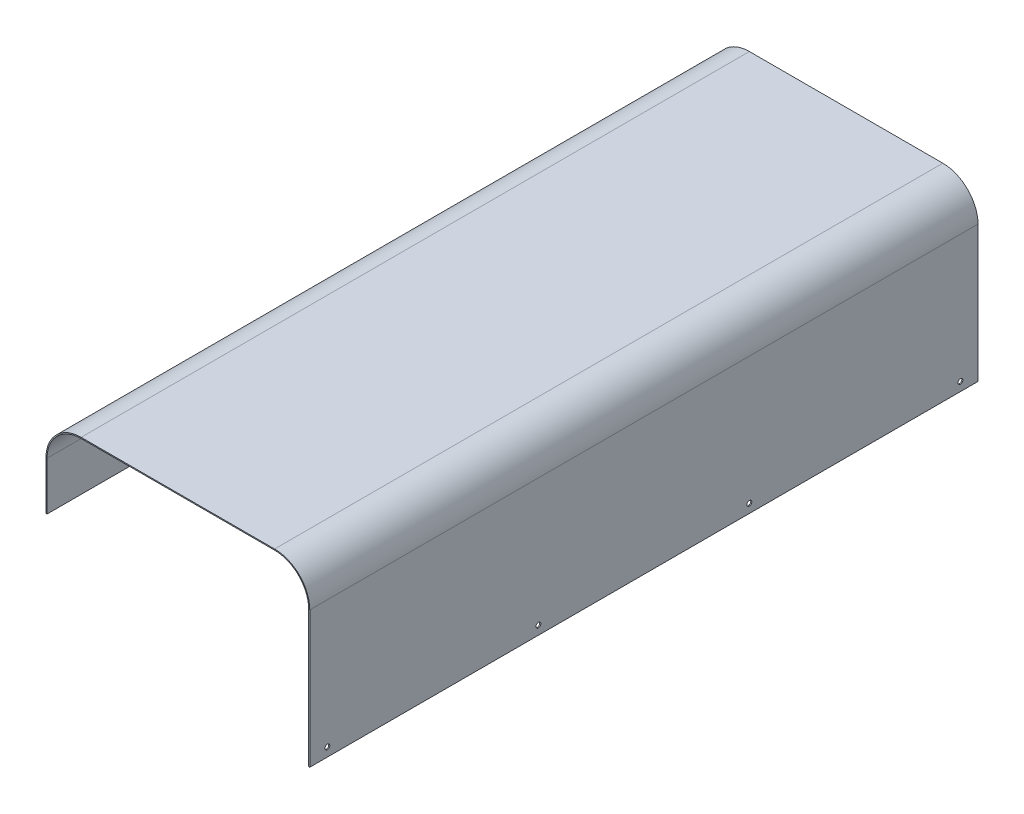
ISO-10303-21;
HEADER;
FILE_DESCRIPTION(('STEP AP214'),'2;1');
FILE_NAME('part.step','',(''),(''),'','','');
FILE_SCHEMA(('AUTOMOTIVE_DESIGN { 1 0 10303 214 1 1 1 1 }'));
ENDSEC;
DATA;
#1=APPLICATION_CONTEXT('core data for automotive mechanical design processes');
#2=APPLICATION_PROTOCOL_DEFINITION('international standard','automotive_design',2000,#1);
#3=PRODUCT_CONTEXT('',#1,'mechanical');
#4=PRODUCT('Part','Part','',(#3));
#5=PRODUCT_RELATED_PRODUCT_CATEGORY('part','',(#4));
#6=PRODUCT_DEFINITION_FORMATION('','',#4);
#7=PRODUCT_DEFINITION_CONTEXT('part definition',#1,'design');
#8=PRODUCT_DEFINITION('design','',#6,#7);
#9=PRODUCT_DEFINITION_SHAPE('','',#8);
#10=(LENGTH_UNIT() NAMED_UNIT(*) SI_UNIT(.MILLI.,.METRE.));
#11=(NAMED_UNIT(*) PLANE_ANGLE_UNIT() SI_UNIT($,.RADIAN.));
#12=(NAMED_UNIT(*) SI_UNIT($,.STERADIAN.) SOLID_ANGLE_UNIT());
#13=UNCERTAINTY_MEASURE_WITH_UNIT(LENGTH_MEASURE(1.E-05),#10,'distance_accuracy_value','');
#14=(GEOMETRIC_REPRESENTATION_CONTEXT(3) GLOBAL_UNCERTAINTY_ASSIGNED_CONTEXT((#13)) GLOBAL_UNIT_ASSIGNED_CONTEXT((#10,
#11,#12)) REPRESENTATION_CONTEXT('',''));
#15=CARTESIAN_POINT('',(0.,0.,0.));
#16=DIRECTION('',(0.,0.,1.));
#17=DIRECTION('',(1.,0.,0.));
#18=AXIS2_PLACEMENT_3D('',#15,#16,#17);
#19=CARTESIAN_POINT('',(-95.25,-60.325,-906.656691417749));
#20=DIRECTION('',(0.,-1.,0.));
#21=DIRECTION('',(0.,0.,1.));
#22=AXIS2_PLACEMENT_3D('',#19,#20,#21);
#23=PLANE('',#22);
#24=DIRECTION('',(-1.,0.,0.));
#25=VECTOR('',#24,1.);
#26=CARTESIAN_POINT('',(-95.25,-60.325,-679.45));
#27=LINE('',#26,#25);
#28=CARTESIAN_POINT('',(-94.488,-60.325,-679.45));
#29=VERTEX_POINT('',#28);
#30=CARTESIAN_POINT('',(-95.25,-60.325,-679.45));
#31=VERTEX_POINT('',#30);
#32=EDGE_CURVE('E11',#29,#31,#27,.T.);
#33=ORIENTED_EDGE('',*,*,#32,.F.);
#34=DIRECTION('',(0.,0.,1.));
#35=VECTOR('',#34,1.);
#36=CARTESIAN_POINT('',(-94.488,-60.325,-906.656691417749));
#37=LINE('',#36,#35);
#38=CARTESIAN_POINT('',(-94.488,-60.325,-196.85));
#39=VERTEX_POINT('',#38);
#40=EDGE_CURVE('E131',#29,#39,#37,.T.);
#41=ORIENTED_EDGE('',*,*,#40,.T.);
#42=DIRECTION('',(-1.,0.,0.));
#43=VECTOR('',#42,1.);
#44=CARTESIAN_POINT('',(-95.25,-60.325,-196.85));
#45=LINE('',#44,#43);
#46=CARTESIAN_POINT('',(-95.25,-60.325,-196.85));
#47=VERTEX_POINT('',#46);
#48=EDGE_CURVE('E46',#39,#47,#45,.T.);
#49=ORIENTED_EDGE('',*,*,#48,.T.);
#50=DIRECTION('',(0.,0.,1.));
#51=VECTOR('',#50,1.);
#52=CARTESIAN_POINT('',(-95.25,-60.325,-906.656691417749));
#53=LINE('',#52,#51);
#54=EDGE_CURVE('E204',#31,#47,#53,.T.);
#55=ORIENTED_EDGE('',*,*,#54,.F.);
#56=EDGE_LOOP('',(#33,#41,#49,#55));
#57=FACE_BOUND('',#56,.T.);
#58=ADVANCED_FACE('F36',(#57),#23,.T.);
#59=CARTESIAN_POINT('',(-95.25,-25.4,-196.85));
#60=DIRECTION('',(0.,0.,-1.));
#61=DIRECTION('',(0.,-1.,0.));
#62=AXIS2_PLACEMENT_3D('',#59,#60,#61);
#63=PLANE('',#62);
#64=ORIENTED_EDGE('',*,*,#48,.F.);
#65=DIRECTION('',(0.,1.,0.));
#66=VECTOR('',#65,1.);
#67=CARTESIAN_POINT('',(-94.488,-25.4,-196.85));
#68=LINE('',#67,#66);
#69=CARTESIAN_POINT('',(-94.488,-25.4,-196.85));
#70=VERTEX_POINT('',#69);
#71=EDGE_CURVE('E136',#70,#39,#68,.F.);
#72=ORIENTED_EDGE('',*,*,#71,.F.);
#73=DIRECTION('',(-1.,0.,0.));
#74=VECTOR('',#73,1.);
#75=CARTESIAN_POINT('',(-95.25,-25.4,-196.85));
#76=LINE('',#75,#74);
#77=CARTESIAN_POINT('',(-95.25,-25.4,-196.85));
#78=VERTEX_POINT('',#77);
#79=EDGE_CURVE('E54',#70,#78,#76,.T.);
#80=ORIENTED_EDGE('',*,*,#79,.T.);
#81=DIRECTION('',(0.,-1.,0.));
#82=VECTOR('',#81,1.);
#83=CARTESIAN_POINT('',(-95.25,-25.4,-196.85));
#84=LINE('',#83,#82);
#85=EDGE_CURVE('E207',#78,#47,#84,.T.);
#86=ORIENTED_EDGE('',*,*,#85,.T.);
#87=EDGE_LOOP('',(#64,#72,#80,#86));
#88=FACE_BOUND('',#87,.T.);
#89=ADVANCED_FACE('F210',(#88),#63,.F.);
#90=CARTESIAN_POINT('',(-69.85,-25.4,-196.85));
#91=DIRECTION('',(0.,0.,-1.));
#92=DIRECTION('',(-1.,0.,0.));
#93=AXIS2_PLACEMENT_3D('',#90,#91,#92);
#94=PLANE('',#93);
#95=ORIENTED_EDGE('',*,*,#79,.F.);
#96=CARTESIAN_POINT('',(-69.85,-25.4,-196.85));
#97=DIRECTION('',(0.,0.,1.));
#98=DIRECTION('',(1.,0.,0.));
#99=AXIS2_PLACEMENT_3D('',#96,#97,#98);
#100=CIRCLE('',#99,24.638);
#101=CARTESIAN_POINT('',(-69.85,-0.762,-196.85));
#102=VERTEX_POINT('',#101);
#103=EDGE_CURVE('E125',#102,#70,#100,.T.);
#104=ORIENTED_EDGE('',*,*,#103,.F.);
#105=DIRECTION('',(0.,1.,0.));
#106=VECTOR('',#105,1.);
#107=CARTESIAN_POINT('',(-69.85,0.,-196.85));
#108=LINE('',#107,#106);
#109=CARTESIAN_POINT('',(-69.85,0.,-196.85));
#110=VERTEX_POINT('',#109);
#111=EDGE_CURVE('E199',#102,#110,#108,.T.);
#112=ORIENTED_EDGE('',*,*,#111,.T.);
#113=CARTESIAN_POINT('',(-69.85,-25.4,-196.85));
#114=DIRECTION('',(0.,0.,1.));
#115=DIRECTION('',(1.,0.,0.));
#116=AXIS2_PLACEMENT_3D('',#113,#114,#115);
#117=CIRCLE('',#116,25.4);
#118=EDGE_CURVE('E114',#110,#78,#117,.T.);
#119=ORIENTED_EDGE('',*,*,#118,.T.);
#120=EDGE_LOOP('',(#95,#104,#112,#119));
#121=FACE_BOUND('',#120,.T.);
#122=ADVANCED_FACE('F238',(#121),#94,.F.);
#123=CARTESIAN_POINT('',(69.85,0.,-196.85));
#124=DIRECTION('',(0.,0.,-1.));
#125=DIRECTION('',(-1.,0.,0.));
#126=AXIS2_PLACEMENT_3D('',#123,#124,#125);
#127=PLANE('',#126);
#128=ORIENTED_EDGE('',*,*,#111,.F.);
#129=DIRECTION('',(-1.,0.,0.));
#130=VECTOR('',#129,1.);
#131=CARTESIAN_POINT('',(69.85,-0.761999999999996,-196.85));
#132=LINE('',#131,#130);
#133=CARTESIAN_POINT('',(69.85,-0.761999999999992,-196.85));
#134=VERTEX_POINT('',#133);
#135=EDGE_CURVE('E153',#134,#102,#132,.T.);
#136=ORIENTED_EDGE('',*,*,#135,.F.);
#137=DIRECTION('',(0.,1.,0.));
#138=VECTOR('',#137,1.);
#139=CARTESIAN_POINT('',(69.85,0.,-196.85));
#140=LINE('',#139,#138);
#141=CARTESIAN_POINT('',(69.85,0.,-196.85));
#142=VERTEX_POINT('',#141);
#143=EDGE_CURVE('E196',#134,#142,#140,.T.);
#144=ORIENTED_EDGE('',*,*,#143,.T.);
#145=DIRECTION('',(-1.,0.,0.));
#146=VECTOR('',#145,1.);
#147=CARTESIAN_POINT('',(69.85,0.,-196.85));
#148=LINE('',#147,#146);
#149=EDGE_CURVE('E235',#142,#110,#148,.T.);
#150=ORIENTED_EDGE('',*,*,#149,.T.);
#151=EDGE_LOOP('',(#128,#136,#144,#150));
#152=FACE_BOUND('',#151,.T.);
#153=ADVANCED_FACE('F230',(#152),#127,.F.);
#154=CARTESIAN_POINT('',(69.85,-25.4,-196.85));
#155=DIRECTION('',(0.,0.,-1.));
#156=DIRECTION('',(-1.,0.,0.));
#157=AXIS2_PLACEMENT_3D('',#154,#155,#156);
#158=PLANE('',#157);
#159=ORIENTED_EDGE('',*,*,#143,.F.);
#160=CARTESIAN_POINT('',(69.85,-25.4,-196.85));
#161=DIRECTION('',(0.,0.,1.));
#162=DIRECTION('',(1.,0.,0.));
#163=AXIS2_PLACEMENT_3D('',#160,#161,#162);
#164=CIRCLE('',#163,24.638);
#165=CARTESIAN_POINT('',(94.488,-25.4000000000001,-196.85));
#166=VERTEX_POINT('',#165);
#167=EDGE_CURVE('E128',#166,#134,#164,.T.);
#168=ORIENTED_EDGE('',*,*,#167,.F.);
#169=DIRECTION('',(1.,0.,0.));
#170=VECTOR('',#169,1.);
#171=CARTESIAN_POINT('',(95.25,-25.4000000000001,-196.85));
#172=LINE('',#171,#170);
#173=CARTESIAN_POINT('',(95.25,-25.4000000000001,-196.85));
#174=VERTEX_POINT('',#173);
#175=EDGE_CURVE('E193',#166,#174,#172,.T.);
#176=ORIENTED_EDGE('',*,*,#175,.T.);
#177=CARTESIAN_POINT('',(69.85,-25.4,-196.85));
#178=DIRECTION('',(0.,0.,1.));
#179=DIRECTION('',(1.,0.,0.));
#180=AXIS2_PLACEMENT_3D('',#177,#178,#179);
#181=CIRCLE('',#180,25.4);
#182=EDGE_CURVE('E293',#174,#142,#181,.T.);
#183=ORIENTED_EDGE('',*,*,#182,.T.);
#184=EDGE_LOOP('',(#159,#168,#176,#183));
#185=FACE_BOUND('',#184,.T.);
#186=ADVANCED_FACE('F461',(#185),#158,.F.);
#187=CARTESIAN_POINT('',(95.25,-123.825,-196.85));
#188=DIRECTION('',(0.,0.,-1.));
#189=DIRECTION('',(0.,1.,0.));
#190=AXIS2_PLACEMENT_3D('',#187,#188,#189);
#191=PLANE('',#190);
#192=ORIENTED_EDGE('',*,*,#175,.F.);
#193=DIRECTION('',(0.,1.,0.));
#194=VECTOR('',#193,1.);
#195=CARTESIAN_POINT('',(94.488,-123.825,-196.85));
#196=LINE('',#195,#194);
#197=CARTESIAN_POINT('',(94.488,-123.825,-196.85));
#198=VERTEX_POINT('',#197);
#199=EDGE_CURVE('E161',#198,#166,#196,.T.);
#200=ORIENTED_EDGE('',*,*,#199,.F.);
#201=DIRECTION('',(1.,0.,0.));
#202=VECTOR('',#201,1.);
#203=CARTESIAN_POINT('',(95.25,-123.825,-196.85));
#204=LINE('',#203,#202);
#205=CARTESIAN_POINT('',(95.25,-123.825,-196.85));
#206=VERTEX_POINT('',#205);
#207=EDGE_CURVE('E190',#198,#206,#204,.T.);
#208=ORIENTED_EDGE('',*,*,#207,.T.);
#209=DIRECTION('',(0.,1.,0.));
#210=VECTOR('',#209,1.);
#211=CARTESIAN_POINT('',(95.25,-123.825,-196.85));
#212=LINE('',#211,#210);
#213=EDGE_CURVE('E271',#206,#174,#212,.T.);
#214=ORIENTED_EDGE('',*,*,#213,.T.);
#215=EDGE_LOOP('',(#192,#200,#208,#214));
#216=FACE_BOUND('',#215,.T.);
#217=ADVANCED_FACE('F314',(#216),#191,.F.);
#218=CARTESIAN_POINT('',(95.25,-123.825,-906.656691417749));
#219=DIRECTION('',(0.,1.,0.));
#220=DIRECTION('',(0.,0.,1.));
#221=AXIS2_PLACEMENT_3D('',#218,#219,#220);
#222=PLANE('',#221);
#223=ORIENTED_EDGE('',*,*,#207,.F.);
#224=DIRECTION('',(0.,0.,-1.));
#225=VECTOR('',#224,1.);
#226=CARTESIAN_POINT('',(94.488,-123.825,-906.656691417749));
#227=LINE('',#226,#225);
#228=CARTESIAN_POINT('',(94.488,-123.825,-679.45));
#229=VERTEX_POINT('',#228);
#230=EDGE_CURVE('E157',#229,#198,#227,.F.);
#231=ORIENTED_EDGE('',*,*,#230,.F.);
#232=DIRECTION('',(1.,0.,0.));
#233=VECTOR('',#232,1.);
#234=CARTESIAN_POINT('',(95.25,-123.825,-679.45));
#235=LINE('',#234,#233);
#236=CARTESIAN_POINT('',(95.25,-123.825,-679.45));
#237=VERTEX_POINT('',#236);
#238=EDGE_CURVE('E187',#229,#237,#235,.T.);
#239=ORIENTED_EDGE('',*,*,#238,.T.);
#240=DIRECTION('',(0.,0.,1.));
#241=VECTOR('',#240,1.);
#242=CARTESIAN_POINT('',(95.25,-123.825,-906.656691417749));
#243=LINE('',#242,#241);
#244=EDGE_CURVE('E259',#237,#206,#243,.T.);
#245=ORIENTED_EDGE('',*,*,#244,.T.);
#246=EDGE_LOOP('',(#223,#231,#239,#245));
#247=FACE_BOUND('',#246,.T.);
#248=ADVANCED_FACE('F258',(#247),#222,.F.);
#249=CARTESIAN_POINT('',(95.25,-123.825,-679.45));
#250=DIRECTION('',(0.,0.,-1.));
#251=DIRECTION('',(0.,1.,0.));
#252=AXIS2_PLACEMENT_3D('',#249,#250,#251);
#253=PLANE('',#252);
#254=ORIENTED_EDGE('',*,*,#238,.F.);
#255=DIRECTION('',(0.,1.,0.));
#256=VECTOR('',#255,1.);
#257=CARTESIAN_POINT('',(94.488,-123.825,-679.45));
#258=LINE('',#257,#256);
#259=CARTESIAN_POINT('',(94.488,-25.4,-679.45));
#260=VERTEX_POINT('',#259);
#261=EDGE_CURVE('E154',#260,#229,#258,.F.);
#262=ORIENTED_EDGE('',*,*,#261,.F.);
#263=DIRECTION('',(1.,0.,0.));
#264=VECTOR('',#263,1.);
#265=CARTESIAN_POINT('',(95.25,-25.4,-679.45));
#266=LINE('',#265,#264);
#267=CARTESIAN_POINT('',(95.25,-25.4,-679.45));
#268=VERTEX_POINT('',#267);
#269=EDGE_CURVE('E184',#260,#268,#266,.T.);
#270=ORIENTED_EDGE('',*,*,#269,.T.);
#271=DIRECTION('',(0.,1.,0.));
#272=VECTOR('',#271,1.);
#273=CARTESIAN_POINT('',(95.25,-123.825,-679.45));
#274=LINE('',#273,#272);
#275=EDGE_CURVE('E268',#268,#237,#274,.F.);
#276=ORIENTED_EDGE('',*,*,#275,.T.);
#277=EDGE_LOOP('',(#254,#262,#270,#276));
#278=FACE_BOUND('',#277,.T.);
#279=ADVANCED_FACE('F274',(#278),#253,.T.);
#280=CARTESIAN_POINT('',(69.85,-25.4,-679.45));
#281=DIRECTION('',(0.,0.,1.));
#282=DIRECTION('',(1.,0.,0.));
#283=AXIS2_PLACEMENT_3D('',#280,#281,#282);
#284=PLANE('',#283);
#285=ORIENTED_EDGE('',*,*,#269,.F.);
#286=CARTESIAN_POINT('',(69.85,-25.4,-679.45));
#287=DIRECTION('',(0.,0.,1.));
#288=DIRECTION('',(1.,0.,0.));
#289=AXIS2_PLACEMENT_3D('',#286,#287,#288);
#290=CIRCLE('',#289,24.638);
#291=CARTESIAN_POINT('',(69.85,-0.761999999999996,-679.45));
#292=VERTEX_POINT('',#291);
#293=EDGE_CURVE('E150',#292,#260,#290,.F.);
#294=ORIENTED_EDGE('',*,*,#293,.F.);
#295=DIRECTION('',(0.,1.,0.));
#296=VECTOR('',#295,1.);
#297=CARTESIAN_POINT('',(69.85,0.,-679.45));
#298=LINE('',#297,#296);
#299=CARTESIAN_POINT('',(69.85,0.,-679.45));
#300=VERTEX_POINT('',#299);
#301=EDGE_CURVE('E181',#292,#300,#298,.T.);
#302=ORIENTED_EDGE('',*,*,#301,.T.);
#303=CARTESIAN_POINT('',(69.85,-25.4,-679.45));
#304=DIRECTION('',(0.,0.,-1.));
#305=DIRECTION('',(-1.,0.,0.));
#306=AXIS2_PLACEMENT_3D('',#303,#304,#305);
#307=CIRCLE('',#306,25.4);
#308=EDGE_CURVE('E291',#300,#268,#307,.T.);
#309=ORIENTED_EDGE('',*,*,#308,.T.);
#310=EDGE_LOOP('',(#285,#294,#302,#309));
#311=FACE_BOUND('',#310,.T.);
#312=ADVANCED_FACE('F308',(#311),#284,.F.);
#313=CARTESIAN_POINT('',(69.85,0.,-679.45));
#314=DIRECTION('',(0.,0.,-1.));
#315=DIRECTION('',(-1.,0.,0.));
#316=AXIS2_PLACEMENT_3D('',#313,#314,#315);
#317=PLANE('',#316);
#318=ORIENTED_EDGE('',*,*,#301,.F.);
#319=DIRECTION('',(-1.,0.,0.));
#320=VECTOR('',#319,1.);
#321=CARTESIAN_POINT('',(69.85,-0.761999999999996,-679.45));
#322=LINE('',#321,#320);
#323=CARTESIAN_POINT('',(-69.85,-0.762,-679.45));
#324=VERTEX_POINT('',#323);
#325=EDGE_CURVE('E145',#324,#292,#322,.F.);
#326=ORIENTED_EDGE('',*,*,#325,.F.);
#327=DIRECTION('',(0.,1.,0.));
#328=VECTOR('',#327,1.);
#329=CARTESIAN_POINT('',(-69.85,0.,-679.45));
#330=LINE('',#329,#328);
#331=CARTESIAN_POINT('',(-69.85,0.,-679.45));
#332=VERTEX_POINT('',#331);
#333=EDGE_CURVE('E113',#324,#332,#330,.T.);
#334=ORIENTED_EDGE('',*,*,#333,.T.);
#335=DIRECTION('',(-1.,0.,0.));
#336=VECTOR('',#335,1.);
#337=CARTESIAN_POINT('',(69.85,0.,-679.45));
#338=LINE('',#337,#336);
#339=EDGE_CURVE('E284',#332,#300,#338,.F.);
#340=ORIENTED_EDGE('',*,*,#339,.T.);
#341=EDGE_LOOP('',(#318,#326,#334,#340));
#342=FACE_BOUND('',#341,.T.);
#343=ADVANCED_FACE('F305',(#342),#317,.T.);
#344=CARTESIAN_POINT('',(-69.85,-25.4,-679.45));
#345=DIRECTION('',(0.,0.,1.));
#346=DIRECTION('',(1.,0.,0.));
#347=AXIS2_PLACEMENT_3D('',#344,#345,#346);
#348=PLANE('',#347);
#349=ORIENTED_EDGE('',*,*,#333,.F.);
#350=CARTESIAN_POINT('',(-69.85,-25.4,-679.45));
#351=DIRECTION('',(0.,0.,1.));
#352=DIRECTION('',(1.,0.,0.));
#353=AXIS2_PLACEMENT_3D('',#350,#351,#352);
#354=CIRCLE('',#353,24.638);
#355=CARTESIAN_POINT('',(-94.488,-25.4,-679.45));
#356=VERTEX_POINT('',#355);
#357=EDGE_CURVE('E122',#356,#324,#354,.F.);
#358=ORIENTED_EDGE('',*,*,#357,.F.);
#359=DIRECTION('',(-1.,0.,0.));
#360=VECTOR('',#359,1.);
#361=CARTESIAN_POINT('',(-95.25,-25.4,-679.45));
#362=LINE('',#361,#360);
#363=CARTESIAN_POINT('',(-95.25,-25.4,-679.45));
#364=VERTEX_POINT('',#363);
#365=EDGE_CURVE('E40',#356,#364,#362,.T.);
#366=ORIENTED_EDGE('',*,*,#365,.T.);
#367=CARTESIAN_POINT('',(-69.85,-25.4,-679.45));
#368=DIRECTION('',(0.,0.,-1.));
#369=DIRECTION('',(-1.,0.,0.));
#370=AXIS2_PLACEMENT_3D('',#367,#368,#369);
#371=CIRCLE('',#370,25.4);
#372=EDGE_CURVE('E211',#364,#332,#371,.T.);
#373=ORIENTED_EDGE('',*,*,#372,.T.);
#374=EDGE_LOOP('',(#349,#358,#366,#373));
#375=FACE_BOUND('',#374,.T.);
#376=ADVANCED_FACE('F133',(#375),#348,.F.);
#377=CARTESIAN_POINT('',(95.25,-117.475,-209.55));
#378=DIRECTION('',(1.,0.,0.));
#379=DIRECTION('',(0.,0.,-1.));
#380=AXIS2_PLACEMENT_3D('',#377,#378,#379);
#381=CYLINDRICAL_SURFACE('',#380,1.75259999999998);
#382=CARTESIAN_POINT('',(95.25,-117.475,-209.55));
#383=DIRECTION('',(1.,0.,0.));
#384=DIRECTION('',(0.,0.,-1.));
#385=AXIS2_PLACEMENT_3D('',#382,#383,#384);
#386=CIRCLE('',#385,1.75259999999998);
#387=CARTESIAN_POINT('',(95.25,-117.475,-211.3026));
#388=VERTEX_POINT('',#387);
#389=EDGE_CURVE('E138',#388,#388,#386,.T.);
#390=ORIENTED_EDGE('',*,*,#389,.T.);
#391=EDGE_LOOP('',(#390));
#392=FACE_BOUND('',#391,.T.);
#393=CARTESIAN_POINT('',(94.488,-117.475,-209.55));
#394=DIRECTION('',(1.,0.,0.));
#395=DIRECTION('',(0.,0.,-1.));
#396=AXIS2_PLACEMENT_3D('',#393,#394,#395);
#397=CIRCLE('',#396,1.75259999999998);
#398=CARTESIAN_POINT('',(94.488,-117.475,-211.3026));
#399=VERTEX_POINT('',#398);
#400=EDGE_CURVE('E169',#399,#399,#397,.T.);
#401=ORIENTED_EDGE('',*,*,#400,.F.);
#402=EDGE_LOOP('',(#401));
#403=FACE_BOUND('',#402,.T.);
#404=ADVANCED_FACE('F337',(#392,#403),#381,.F.);
#405=CARTESIAN_POINT('',(95.25,-117.475,-361.95));
#406=DIRECTION('',(1.,0.,0.));
#407=DIRECTION('',(0.,0.,-1.));
#408=AXIS2_PLACEMENT_3D('',#405,#406,#407);
#409=CYLINDRICAL_SURFACE('',#408,1.75260000000003);
#410=CARTESIAN_POINT('',(95.25,-117.475,-361.95));
#411=DIRECTION('',(1.,0.,0.));
#412=DIRECTION('',(0.,0.,-1.));
#413=AXIS2_PLACEMENT_3D('',#410,#411,#412);
#414=CIRCLE('',#413,1.75260000000003);
#415=CARTESIAN_POINT('',(95.25,-117.475,-363.7026));
#416=VERTEX_POINT('',#415);
#417=EDGE_CURVE('E361',#416,#416,#414,.T.);
#418=ORIENTED_EDGE('',*,*,#417,.T.);
#419=EDGE_LOOP('',(#418));
#420=FACE_BOUND('',#419,.T.);
#421=CARTESIAN_POINT('',(94.488,-117.475,-361.95));
#422=DIRECTION('',(1.,0.,0.));
#423=DIRECTION('',(0.,0.,-1.));
#424=AXIS2_PLACEMENT_3D('',#421,#422,#423);
#425=CIRCLE('',#424,1.75260000000003);
#426=CARTESIAN_POINT('',(94.488,-117.475,-363.7026));
#427=VERTEX_POINT('',#426);
#428=EDGE_CURVE('E172',#427,#427,#425,.T.);
#429=ORIENTED_EDGE('',*,*,#428,.F.);
#430=EDGE_LOOP('',(#429));
#431=FACE_BOUND('',#430,.T.);
#432=ADVANCED_FACE('F340',(#420,#431),#409,.F.);
#433=CARTESIAN_POINT('',(95.25,-117.475,-514.35));
#434=DIRECTION('',(1.,0.,0.));
#435=DIRECTION('',(0.,0.,-1.));
#436=AXIS2_PLACEMENT_3D('',#433,#434,#435);
#437=CYLINDRICAL_SURFACE('',#436,1.75260000000003);
#438=CARTESIAN_POINT('',(95.25,-117.475,-514.35));
#439=DIRECTION('',(1.,0.,0.));
#440=DIRECTION('',(0.,0.,-1.));
#441=AXIS2_PLACEMENT_3D('',#438,#439,#440);
#442=CIRCLE('',#441,1.75260000000003);
#443=CARTESIAN_POINT('',(95.25,-117.475,-516.1026));
#444=VERTEX_POINT('',#443);
#445=EDGE_CURVE('E354',#444,#444,#442,.T.);
#446=ORIENTED_EDGE('',*,*,#445,.T.);
#447=EDGE_LOOP('',(#446));
#448=FACE_BOUND('',#447,.T.);
#449=CARTESIAN_POINT('',(94.488,-117.475,-514.35));
#450=DIRECTION('',(1.,0.,0.));
#451=DIRECTION('',(0.,0.,-1.));
#452=AXIS2_PLACEMENT_3D('',#449,#450,#451);
#453=CIRCLE('',#452,1.75260000000003);
#454=CARTESIAN_POINT('',(94.488,-117.475,-516.1026));
#455=VERTEX_POINT('',#454);
#456=EDGE_CURVE('E175',#455,#455,#453,.T.);
#457=ORIENTED_EDGE('',*,*,#456,.F.);
#458=EDGE_LOOP('',(#457));
#459=FACE_BOUND('',#458,.T.);
#460=ADVANCED_FACE('F343',(#448,#459),#437,.F.);
#461=CARTESIAN_POINT('',(95.25,-117.475,-666.75));
#462=DIRECTION('',(1.,0.,0.));
#463=DIRECTION('',(0.,0.,-1.));
#464=AXIS2_PLACEMENT_3D('',#461,#462,#463);
#465=CYLINDRICAL_SURFACE('',#464,1.75260000000003);
#466=CARTESIAN_POINT('',(95.25,-117.475,-666.75));
#467=DIRECTION('',(1.,0.,0.));
#468=DIRECTION('',(0.,0.,-1.));
#469=AXIS2_PLACEMENT_3D('',#466,#467,#468);
#470=CIRCLE('',#469,1.75260000000003);
#471=CARTESIAN_POINT('',(95.25,-117.475,-668.5026));
#472=VERTEX_POINT('',#471);
#473=EDGE_CURVE('E272',#472,#472,#470,.T.);
#474=ORIENTED_EDGE('',*,*,#473,.T.);
#475=EDGE_LOOP('',(#474));
#476=FACE_BOUND('',#475,.T.);
#477=CARTESIAN_POINT('',(94.488,-117.475,-666.75));
#478=DIRECTION('',(1.,0.,0.));
#479=DIRECTION('',(0.,0.,-1.));
#480=AXIS2_PLACEMENT_3D('',#477,#478,#479);
#481=CIRCLE('',#480,1.75260000000003);
#482=CARTESIAN_POINT('',(94.488,-117.475,-668.5026));
#483=VERTEX_POINT('',#482);
#484=EDGE_CURVE('E160',#483,#483,#481,.T.);
#485=ORIENTED_EDGE('',*,*,#484,.F.);
#486=EDGE_LOOP('',(#485));
#487=FACE_BOUND('',#486,.T.);
#488=ADVANCED_FACE('F38',(#476,#487),#465,.F.);
#489=CARTESIAN_POINT('',(-95.25,-25.4,-679.45));
#490=DIRECTION('',(0.,0.,1.));
#491=DIRECTION('',(0.,1.,0.));
#492=AXIS2_PLACEMENT_3D('',#489,#490,#491);
#493=PLANE('',#492);
#494=DIRECTION('',(0.,1.,0.));
#495=VECTOR('',#494,1.);
#496=CARTESIAN_POINT('',(-94.488,-25.4,-679.45));
#497=LINE('',#496,#495);
#498=EDGE_CURVE('E104',#29,#356,#497,.T.);
#499=ORIENTED_EDGE('',*,*,#498,.F.);
#500=ORIENTED_EDGE('',*,*,#32,.T.);
#501=DIRECTION('',(0.,1.,0.));
#502=VECTOR('',#501,1.);
#503=CARTESIAN_POINT('',(-95.25,-25.4,-679.45));
#504=LINE('',#503,#502);
#505=EDGE_CURVE('E107',#31,#364,#504,.T.);
#506=ORIENTED_EDGE('',*,*,#505,.T.);
#507=ORIENTED_EDGE('',*,*,#365,.F.);
#508=EDGE_LOOP('',(#499,#500,#506,#507));
#509=FACE_BOUND('',#508,.T.);
#510=ADVANCED_FACE('F102',(#509),#493,.F.);
#511=CARTESIAN_POINT('',(-69.85,-25.4,-906.656691417749));
#512=DIRECTION('',(0.,0.,1.));
#513=DIRECTION('',(1.,0.,0.));
#514=AXIS2_PLACEMENT_3D('',#511,#512,#513);
#515=CYLINDRICAL_SURFACE('',#514,25.4);
#516=DIRECTION('',(0.,0.,1.));
#517=VECTOR('',#516,1.);
#518=CARTESIAN_POINT('',(-69.85,0.,-906.656691417749));
#519=LINE('',#518,#517);
#520=EDGE_CURVE('E287',#332,#110,#519,.T.);
#521=ORIENTED_EDGE('',*,*,#520,.F.);
#522=ORIENTED_EDGE('',*,*,#372,.F.);
#523=DIRECTION('',(0.,0.,1.));
#524=VECTOR('',#523,1.);
#525=CARTESIAN_POINT('',(-95.25,-25.4,-906.656691417749));
#526=LINE('',#525,#524);
#527=EDGE_CURVE('E296',#364,#78,#526,.T.);
#528=ORIENTED_EDGE('',*,*,#527,.T.);
#529=ORIENTED_EDGE('',*,*,#118,.F.);
#530=EDGE_LOOP('',(#521,#522,#528,#529));
#531=FACE_BOUND('',#530,.T.);
#532=ADVANCED_FACE('F299',(#531),#515,.T.);
#533=CARTESIAN_POINT('',(-95.25,-25.4,-906.656691417749));
#534=DIRECTION('',(-1.,0.,0.));
#535=DIRECTION('',(0.,0.,1.));
#536=AXIS2_PLACEMENT_3D('',#533,#534,#535);
#537=PLANE('',#536);
#538=ORIENTED_EDGE('',*,*,#527,.F.);
#539=ORIENTED_EDGE('',*,*,#505,.F.);
#540=ORIENTED_EDGE('',*,*,#54,.T.);
#541=ORIENTED_EDGE('',*,*,#85,.F.);
#542=EDGE_LOOP('',(#538,#539,#540,#541));
#543=FACE_BOUND('',#542,.T.);
#544=ADVANCED_FACE('F206',(#543),#537,.T.);
#545=CARTESIAN_POINT('',(69.85,-25.4,-906.656691417749));
#546=DIRECTION('',(0.,0.,1.));
#547=DIRECTION('',(1.,0.,0.));
#548=AXIS2_PLACEMENT_3D('',#545,#546,#547);
#549=CYLINDRICAL_SURFACE('',#548,25.4);
#550=DIRECTION('',(0.,0.,1.));
#551=VECTOR('',#550,1.);
#552=CARTESIAN_POINT('',(95.25,-25.4000000000001,-906.656691417749));
#553=LINE('',#552,#551);
#554=EDGE_CURVE('E275',#268,#174,#553,.T.);
#555=ORIENTED_EDGE('',*,*,#554,.F.);
#556=ORIENTED_EDGE('',*,*,#308,.F.);
#557=DIRECTION('',(0.,0.,1.));
#558=VECTOR('',#557,1.);
#559=CARTESIAN_POINT('',(69.85,0.,-906.656691417749));
#560=LINE('',#559,#558);
#561=EDGE_CURVE('E281',#300,#142,#560,.T.);
#562=ORIENTED_EDGE('',*,*,#561,.T.);
#563=ORIENTED_EDGE('',*,*,#182,.F.);
#564=EDGE_LOOP('',(#555,#556,#562,#563));
#565=FACE_BOUND('',#564,.T.);
#566=ADVANCED_FACE('F311',(#565),#549,.T.);
#567=CARTESIAN_POINT('',(69.85,0.,-906.656691417749));
#568=DIRECTION('',(0.,1.,0.));
#569=DIRECTION('',(-1.,0.,0.));
#570=AXIS2_PLACEMENT_3D('',#567,#568,#569);
#571=PLANE('',#570);
#572=ORIENTED_EDGE('',*,*,#561,.F.);
#573=ORIENTED_EDGE('',*,*,#339,.F.);
#574=ORIENTED_EDGE('',*,*,#520,.T.);
#575=ORIENTED_EDGE('',*,*,#149,.F.);
#576=EDGE_LOOP('',(#572,#573,#574,#575));
#577=FACE_BOUND('',#576,.T.);
#578=ADVANCED_FACE('F303',(#577),#571,.T.);
#579=CARTESIAN_POINT('',(95.25,-123.825,-906.656691417749));
#580=DIRECTION('',(1.,0.,0.));
#581=DIRECTION('',(0.,0.,-1.));
#582=AXIS2_PLACEMENT_3D('',#579,#580,#581);
#583=PLANE('',#582);
#584=ORIENTED_EDGE('',*,*,#389,.F.);
#585=EDGE_LOOP('',(#584));
#586=FACE_BOUND('',#585,.T.);
#587=ORIENTED_EDGE('',*,*,#417,.F.);
#588=EDGE_LOOP('',(#587));
#589=FACE_BOUND('',#588,.T.);
#590=ORIENTED_EDGE('',*,*,#445,.F.);
#591=EDGE_LOOP('',(#590));
#592=FACE_BOUND('',#591,.T.);
#593=ORIENTED_EDGE('',*,*,#473,.F.);
#594=EDGE_LOOP('',(#593));
#595=FACE_BOUND('',#594,.T.);
#596=ORIENTED_EDGE('',*,*,#244,.F.);
#597=ORIENTED_EDGE('',*,*,#275,.F.);
#598=ORIENTED_EDGE('',*,*,#554,.T.);
#599=ORIENTED_EDGE('',*,*,#213,.F.);
#600=EDGE_LOOP('',(#596,#597,#598,#599));
#601=FACE_BOUND('',#600,.T.);
#602=ADVANCED_FACE('F266',(#586,#589,#592,#595,#601),#583,.T.);
#603=CARTESIAN_POINT('',(-69.85,-25.4,-906.656691417749));
#604=DIRECTION('',(0.,0.,1.));
#605=DIRECTION('',(1.,0.,0.));
#606=AXIS2_PLACEMENT_3D('',#603,#604,#605);
#607=CYLINDRICAL_SURFACE('',#606,24.638);
#608=DIRECTION('',(0.,0.,1.));
#609=VECTOR('',#608,1.);
#610=CARTESIAN_POINT('',(-69.85,-0.762,-906.656691417749));
#611=LINE('',#610,#609);
#612=EDGE_CURVE('E148',#324,#102,#611,.T.);
#613=ORIENTED_EDGE('',*,*,#612,.T.);
#614=ORIENTED_EDGE('',*,*,#103,.T.);
#615=DIRECTION('',(0.,0.,1.));
#616=VECTOR('',#615,1.);
#617=CARTESIAN_POINT('',(-94.488,-25.4,-906.656691417749));
#618=LINE('',#617,#616);
#619=EDGE_CURVE('E119',#356,#70,#618,.T.);
#620=ORIENTED_EDGE('',*,*,#619,.F.);
#621=ORIENTED_EDGE('',*,*,#357,.T.);
#622=EDGE_LOOP('',(#613,#614,#620,#621));
#623=FACE_BOUND('',#622,.T.);
#624=ADVANCED_FACE('F121',(#623),#607,.F.);
#625=CARTESIAN_POINT('',(-94.488,-25.4,-906.656691417749));
#626=DIRECTION('',(-1.,0.,0.));
#627=DIRECTION('',(0.,0.,1.));
#628=AXIS2_PLACEMENT_3D('',#625,#626,#627);
#629=PLANE('',#628);
#630=ORIENTED_EDGE('',*,*,#619,.T.);
#631=ORIENTED_EDGE('',*,*,#71,.T.);
#632=ORIENTED_EDGE('',*,*,#40,.F.);
#633=ORIENTED_EDGE('',*,*,#498,.T.);
#634=EDGE_LOOP('',(#630,#631,#632,#633));
#635=FACE_BOUND('',#634,.T.);
#636=ADVANCED_FACE('F130',(#635),#629,.F.);
#637=CARTESIAN_POINT('',(69.85,-25.4,-906.656691417749));
#638=DIRECTION('',(0.,0.,1.));
#639=DIRECTION('',(1.,0.,0.));
#640=AXIS2_PLACEMENT_3D('',#637,#638,#639);
#641=CYLINDRICAL_SURFACE('',#640,24.638);
#642=DIRECTION('',(0.,0.,-1.));
#643=VECTOR('',#642,1.);
#644=CARTESIAN_POINT('',(94.488,-25.4,-906.656691417749));
#645=LINE('',#644,#643);
#646=EDGE_CURVE('E143',#260,#166,#645,.F.);
#647=ORIENTED_EDGE('',*,*,#646,.T.);
#648=ORIENTED_EDGE('',*,*,#167,.T.);
#649=DIRECTION('',(0.,0.,1.));
#650=VECTOR('',#649,1.);
#651=CARTESIAN_POINT('',(69.85,-0.761999999999992,-906.656691417749));
#652=LINE('',#651,#650);
#653=EDGE_CURVE('E149',#292,#134,#652,.T.);
#654=ORIENTED_EDGE('',*,*,#653,.F.);
#655=ORIENTED_EDGE('',*,*,#293,.T.);
#656=EDGE_LOOP('',(#647,#648,#654,#655));
#657=FACE_BOUND('',#656,.T.);
#658=ADVANCED_FACE('F226',(#657),#641,.F.);
#659=CARTESIAN_POINT('',(69.85,-0.761999999999996,-906.656691417749));
#660=DIRECTION('',(0.,1.,0.));
#661=DIRECTION('',(-1.,0.,0.));
#662=AXIS2_PLACEMENT_3D('',#659,#660,#661);
#663=PLANE('',#662);
#664=ORIENTED_EDGE('',*,*,#653,.T.);
#665=ORIENTED_EDGE('',*,*,#135,.T.);
#666=ORIENTED_EDGE('',*,*,#612,.F.);
#667=ORIENTED_EDGE('',*,*,#325,.T.);
#668=EDGE_LOOP('',(#664,#665,#666,#667));
#669=FACE_BOUND('',#668,.T.);
#670=ADVANCED_FACE('F220',(#669),#663,.F.);
#671=CARTESIAN_POINT('',(94.488,-123.825,-906.656691417749));
#672=DIRECTION('',(1.,0.,0.));
#673=DIRECTION('',(0.,0.,-1.));
#674=AXIS2_PLACEMENT_3D('',#671,#672,#673);
#675=PLANE('',#674);
#676=ORIENTED_EDGE('',*,*,#400,.T.);
#677=EDGE_LOOP('',(#676));
#678=FACE_BOUND('',#677,.T.);
#679=ORIENTED_EDGE('',*,*,#428,.T.);
#680=EDGE_LOOP('',(#679));
#681=FACE_BOUND('',#680,.T.);
#682=ORIENTED_EDGE('',*,*,#456,.T.);
#683=EDGE_LOOP('',(#682));
#684=FACE_BOUND('',#683,.T.);
#685=ORIENTED_EDGE('',*,*,#484,.T.);
#686=EDGE_LOOP('',(#685));
#687=FACE_BOUND('',#686,.T.);
#688=ORIENTED_EDGE('',*,*,#230,.T.);
#689=ORIENTED_EDGE('',*,*,#199,.T.);
#690=ORIENTED_EDGE('',*,*,#646,.F.);
#691=ORIENTED_EDGE('',*,*,#261,.T.);
#692=EDGE_LOOP('',(#688,#689,#690,#691));
#693=FACE_BOUND('',#692,.T.);
#694=ADVANCED_FACE('F317',(#678,#681,#684,#687,#693),#675,.F.);
#695=CLOSED_SHELL('',(#58,#89,#122,#153,#186,#217,#248,#279,#312,#343,#376,#404,#432,#460,#488,
#510,#532,#544,#566,#578,#602,#624,#636,#658,#670,#694));
#696=MANIFOLD_SOLID_BREP('B2',#695);
#697=ADVANCED_BREP_SHAPE_REPRESENTATION('',(#18,#696),#14);
#698=SHAPE_DEFINITION_REPRESENTATION(#9,#697);
ENDSEC;
END-ISO-10303-21;
